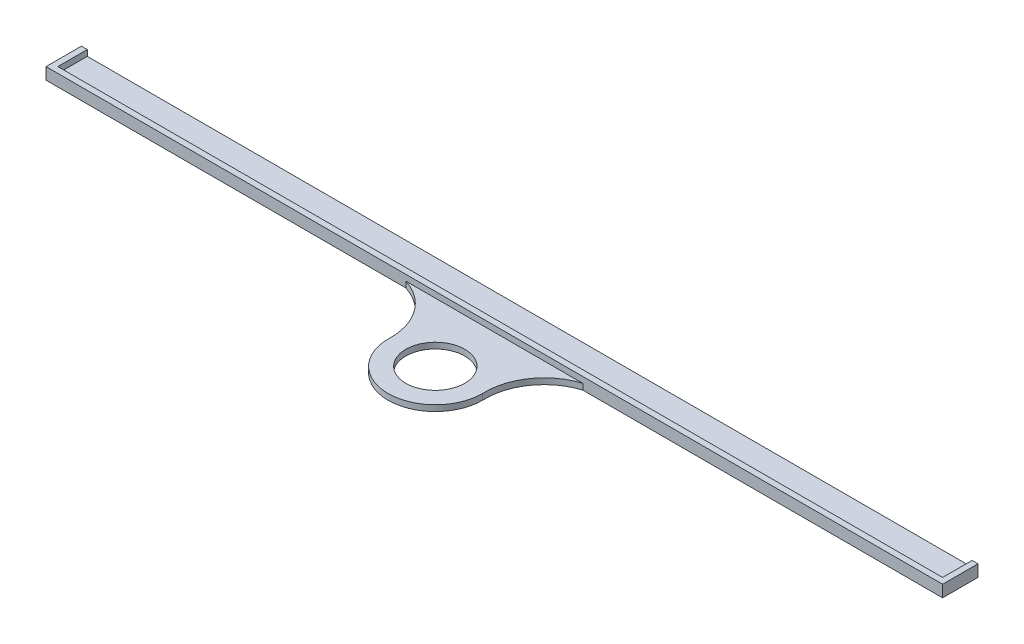
ISO-10303-21;
HEADER;
FILE_DESCRIPTION(('STEP AP214'),'2;1');
FILE_NAME('part.step','',(''),(''),'','','');
FILE_SCHEMA(('AUTOMOTIVE_DESIGN { 1 0 10303 214 1 1 1 1 }'));
ENDSEC;
DATA;
#1=APPLICATION_CONTEXT('core data for automotive mechanical design processes');
#2=APPLICATION_PROTOCOL_DEFINITION('international standard','automotive_design',2000,#1);
#3=PRODUCT_CONTEXT('',#1,'mechanical');
#4=PRODUCT('Part','Part','',(#3));
#5=PRODUCT_RELATED_PRODUCT_CATEGORY('part','',(#4));
#6=PRODUCT_DEFINITION_FORMATION('','',#4);
#7=PRODUCT_DEFINITION_CONTEXT('part definition',#1,'design');
#8=PRODUCT_DEFINITION('design','',#6,#7);
#9=PRODUCT_DEFINITION_SHAPE('','',#8);
#10=(LENGTH_UNIT() NAMED_UNIT(*) SI_UNIT(.MILLI.,.METRE.));
#11=(NAMED_UNIT(*) PLANE_ANGLE_UNIT() SI_UNIT($,.RADIAN.));
#12=(NAMED_UNIT(*) SI_UNIT($,.STERADIAN.) SOLID_ANGLE_UNIT());
#13=UNCERTAINTY_MEASURE_WITH_UNIT(LENGTH_MEASURE(1.E-05),#10,'distance_accuracy_value','');
#14=(GEOMETRIC_REPRESENTATION_CONTEXT(3) GLOBAL_UNCERTAINTY_ASSIGNED_CONTEXT((#13)) GLOBAL_UNIT_ASSIGNED_CONTEXT((#10,
#11,#12)) REPRESENTATION_CONTEXT('',''));
#15=CARTESIAN_POINT('',(0.,0.,0.));
#16=DIRECTION('',(0.,0.,1.));
#17=DIRECTION('',(1.,0.,0.));
#18=AXIS2_PLACEMENT_3D('',#15,#16,#17);
#19=CARTESIAN_POINT('',(0.,0.,0.));
#20=DIRECTION('',(0.,1.,0.));
#21=DIRECTION('',(0.,0.,1.));
#22=AXIS2_PLACEMENT_3D('',#19,#20,#21);
#23=PLANE('',#22);
#24=DIRECTION('',(1.,0.,0.));
#25=VECTOR('',#24,1.);
#26=CARTESIAN_POINT('',(0.,0.,-5.99999999999999));
#27=LINE('',#26,#25);
#28=CARTESIAN_POINT('',(-150.,0.,-5.99999999999999));
#29=VERTEX_POINT('',#28);
#30=CARTESIAN_POINT('',(150.,0.,-5.99999999999999));
#31=VERTEX_POINT('',#30);
#32=EDGE_CURVE('E217',#29,#31,#27,.T.);
#33=ORIENTED_EDGE('',*,*,#32,.F.);
#34=DIRECTION('',(0.,0.,1.));
#35=VECTOR('',#34,1.);
#36=CARTESIAN_POINT('',(-150.,0.,0.));
#37=LINE('',#36,#35);
#38=CARTESIAN_POINT('',(-150.,0.,4.00000000000001));
#39=VERTEX_POINT('',#38);
#40=EDGE_CURVE('E58',#29,#39,#37,.T.);
#41=ORIENTED_EDGE('',*,*,#40,.T.);
#42=DIRECTION('',(1.,0.,0.));
#43=VECTOR('',#42,1.);
#44=CARTESIAN_POINT('',(0.,0.,3.99999999999999));
#45=LINE('',#44,#43);
#46=CARTESIAN_POINT('',(150.,0.,3.99999999999999));
#47=VERTEX_POINT('',#46);
#48=EDGE_CURVE('E63',#39,#47,#45,.T.);
#49=ORIENTED_EDGE('',*,*,#48,.T.);
#50=DIRECTION('',(0.,0.,1.));
#51=VECTOR('',#50,1.);
#52=CARTESIAN_POINT('',(150.,0.,0.));
#53=LINE('',#52,#51);
#54=EDGE_CURVE('E173',#31,#47,#53,.T.);
#55=ORIENTED_EDGE('',*,*,#54,.F.);
#56=EDGE_LOOP('',(#33,#41,#49,#55));
#57=FACE_BOUND('',#56,.T.);
#58=ADVANCED_FACE('F41',(#57),#23,.T.);
#59=CARTESIAN_POINT('',(-152.,-2.,0.));
#60=DIRECTION('',(1.,0.,0.));
#61=DIRECTION('',(0.,0.,-1.));
#62=AXIS2_PLACEMENT_3D('',#59,#60,#61);
#63=PLANE('',#62);
#64=DIRECTION('',(0.,1.,0.));
#65=VECTOR('',#64,1.);
#66=CARTESIAN_POINT('',(-152.,-2.,6.00000000000001));
#67=LINE('',#66,#65);
#68=CARTESIAN_POINT('',(-152.,-2.,6.00000000000001));
#69=VERTEX_POINT('',#68);
#70=CARTESIAN_POINT('',(-152.,2.,6.00000000000001));
#71=VERTEX_POINT('',#70);
#72=EDGE_CURVE('E50',#69,#71,#67,.T.);
#73=ORIENTED_EDGE('',*,*,#72,.T.);
#74=DIRECTION('',(0.,0.,1.));
#75=VECTOR('',#74,1.);
#76=CARTESIAN_POINT('',(-152.,2.,0.));
#77=LINE('',#76,#75);
#78=CARTESIAN_POINT('',(-152.,2.,-5.99999999999999));
#79=VERTEX_POINT('',#78);
#80=EDGE_CURVE('E135',#79,#71,#77,.T.);
#81=ORIENTED_EDGE('',*,*,#80,.F.);
#82=DIRECTION('',(0.,1.,0.));
#83=VECTOR('',#82,1.);
#84=CARTESIAN_POINT('',(-152.,-2.,-5.99999999999999));
#85=LINE('',#84,#83);
#86=CARTESIAN_POINT('',(-152.,-2.,-5.99999999999999));
#87=VERTEX_POINT('',#86);
#88=EDGE_CURVE('E140',#87,#79,#85,.T.);
#89=ORIENTED_EDGE('',*,*,#88,.F.);
#90=DIRECTION('',(0.,0.,-1.));
#91=VECTOR('',#90,1.);
#92=CARTESIAN_POINT('',(-152.,-2.,0.));
#93=LINE('',#92,#91);
#94=EDGE_CURVE('E136',#69,#87,#93,.T.);
#95=ORIENTED_EDGE('',*,*,#94,.F.);
#96=EDGE_LOOP('',(#73,#81,#89,#95));
#97=FACE_BOUND('',#96,.T.);
#98=ADVANCED_FACE('F132',(#97),#63,.F.);
#99=CARTESIAN_POINT('',(0.,-2.,-5.99999999999999));
#100=DIRECTION('',(0.,0.,1.));
#101=DIRECTION('',(1.,0.,0.));
#102=AXIS2_PLACEMENT_3D('',#99,#100,#101);
#103=PLANE('',#102);
#104=ORIENTED_EDGE('',*,*,#88,.T.);
#105=DIRECTION('',(-1.,0.,0.));
#106=VECTOR('',#105,1.);
#107=CARTESIAN_POINT('',(0.,2.,-5.99999999999999));
#108=LINE('',#107,#106);
#109=CARTESIAN_POINT('',(-150.,2.,-5.99999999999999));
#110=VERTEX_POINT('',#109);
#111=EDGE_CURVE('E156',#110,#79,#108,.T.);
#112=ORIENTED_EDGE('',*,*,#111,.F.);
#113=DIRECTION('',(0.,-1.,0.));
#114=VECTOR('',#113,1.);
#115=CARTESIAN_POINT('',(-150.,2.,-5.99999999999999));
#116=LINE('',#115,#114);
#117=EDGE_CURVE('E171',#110,#29,#116,.T.);
#118=ORIENTED_EDGE('',*,*,#117,.T.);
#119=ORIENTED_EDGE('',*,*,#32,.T.);
#120=DIRECTION('',(0.,-1.,0.));
#121=VECTOR('',#120,1.);
#122=CARTESIAN_POINT('',(150.,2.,-5.99999999999999));
#123=LINE('',#122,#121);
#124=CARTESIAN_POINT('',(150.,2.,-5.99999999999999));
#125=VERTEX_POINT('',#124);
#126=EDGE_CURVE('E183',#125,#31,#123,.T.);
#127=ORIENTED_EDGE('',*,*,#126,.F.);
#128=DIRECTION('',(-1.,0.,0.));
#129=VECTOR('',#128,1.);
#130=CARTESIAN_POINT('',(0.,2.,-5.99999999999999));
#131=LINE('',#130,#129);
#132=CARTESIAN_POINT('',(152.,2.,-5.99999999999999));
#133=VERTEX_POINT('',#132);
#134=EDGE_CURVE('E161',#133,#125,#131,.T.);
#135=ORIENTED_EDGE('',*,*,#134,.F.);
#136=DIRECTION('',(0.,1.,0.));
#137=VECTOR('',#136,1.);
#138=CARTESIAN_POINT('',(152.,-2.,-5.99999999999999));
#139=LINE('',#138,#137);
#140=CARTESIAN_POINT('',(152.,-2.,-5.99999999999999));
#141=VERTEX_POINT('',#140);
#142=EDGE_CURVE('E223',#141,#133,#139,.T.);
#143=ORIENTED_EDGE('',*,*,#142,.F.);
#144=DIRECTION('',(1.,0.,0.));
#145=VECTOR('',#144,1.);
#146=CARTESIAN_POINT('',(0.,-2.,-5.99999999999999));
#147=LINE('',#146,#145);
#148=EDGE_CURVE('E203',#87,#141,#147,.T.);
#149=ORIENTED_EDGE('',*,*,#148,.F.);
#150=EDGE_LOOP('',(#104,#112,#118,#119,#127,#135,#143,#149));
#151=FACE_BOUND('',#150,.T.);
#152=ADVANCED_FACE('F255',(#151),#103,.F.);
#153=CARTESIAN_POINT('',(152.,-2.,0.));
#154=DIRECTION('',(1.,0.,0.));
#155=DIRECTION('',(0.,0.,-1.));
#156=AXIS2_PLACEMENT_3D('',#153,#154,#155);
#157=PLANE('',#156);
#158=ORIENTED_EDGE('',*,*,#142,.T.);
#159=DIRECTION('',(0.,0.,-1.));
#160=VECTOR('',#159,1.);
#161=CARTESIAN_POINT('',(152.,2.,0.));
#162=LINE('',#161,#160);
#163=CARTESIAN_POINT('',(152.,2.,6.00000000000001));
#164=VERTEX_POINT('',#163);
#165=EDGE_CURVE('E150',#164,#133,#162,.T.);
#166=ORIENTED_EDGE('',*,*,#165,.F.);
#167=DIRECTION('',(0.,1.,0.));
#168=VECTOR('',#167,1.);
#169=CARTESIAN_POINT('',(152.,-2.,6.00000000000001));
#170=LINE('',#169,#168);
#171=CARTESIAN_POINT('',(152.,-2.,6.00000000000001));
#172=VERTEX_POINT('',#171);
#173=EDGE_CURVE('E146',#172,#164,#170,.T.);
#174=ORIENTED_EDGE('',*,*,#173,.F.);
#175=DIRECTION('',(0.,0.,-1.));
#176=VECTOR('',#175,1.);
#177=CARTESIAN_POINT('',(152.,-2.,0.));
#178=LINE('',#177,#176);
#179=EDGE_CURVE('E200',#172,#141,#178,.T.);
#180=ORIENTED_EDGE('',*,*,#179,.T.);
#181=EDGE_LOOP('',(#158,#166,#174,#180));
#182=FACE_BOUND('',#181,.T.);
#183=ADVANCED_FACE('F251',(#182),#157,.T.);
#184=CARTESIAN_POINT('',(0.,-2.,6.00000000000001));
#185=DIRECTION('',(0.,0.,1.));
#186=DIRECTION('',(1.,0.,0.));
#187=AXIS2_PLACEMENT_3D('',#184,#185,#186);
#188=PLANE('',#187);
#189=ORIENTED_EDGE('',*,*,#173,.T.);
#190=DIRECTION('',(1.,0.,0.));
#191=VECTOR('',#190,1.);
#192=CARTESIAN_POINT('',(0.,2.,6.00000000000001));
#193=LINE('',#192,#191);
#194=EDGE_CURVE('E143',#71,#164,#193,.T.);
#195=ORIENTED_EDGE('',*,*,#194,.F.);
#196=ORIENTED_EDGE('',*,*,#72,.F.);
#197=DIRECTION('',(1.,0.,0.));
#198=VECTOR('',#197,1.);
#199=CARTESIAN_POINT('',(0.,-2.,6.00000000000001));
#200=LINE('',#199,#198);
#201=CARTESIAN_POINT('',(-30.,-2.,6.00000000000001));
#202=VERTEX_POINT('',#201);
#203=EDGE_CURVE('E187',#69,#202,#200,.T.);
#204=ORIENTED_EDGE('',*,*,#203,.T.);
#205=DIRECTION('',(0.,1.,0.));
#206=VECTOR('',#205,1.);
#207=CARTESIAN_POINT('',(-30.,-2.,6.00000000000001));
#208=LINE('',#207,#206);
#209=CARTESIAN_POINT('',(-30.,0.,6.00000000000001));
#210=VERTEX_POINT('',#209);
#211=EDGE_CURVE('E45',#202,#210,#208,.T.);
#212=ORIENTED_EDGE('',*,*,#211,.T.);
#213=DIRECTION('',(1.,0.,0.));
#214=VECTOR('',#213,1.);
#215=CARTESIAN_POINT('',(0.,0.,6.00000000000001));
#216=LINE('',#215,#214);
#217=CARTESIAN_POINT('',(30.,0.,6.00000000000001));
#218=VERTEX_POINT('',#217);
#219=EDGE_CURVE('E11',#210,#218,#216,.T.);
#220=ORIENTED_EDGE('',*,*,#219,.T.);
#221=DIRECTION('',(0.,1.,0.));
#222=VECTOR('',#221,1.);
#223=CARTESIAN_POINT('',(30.,-2.,6.00000000000001));
#224=LINE('',#223,#222);
#225=CARTESIAN_POINT('',(30.,-2.,6.00000000000001));
#226=VERTEX_POINT('',#225);
#227=EDGE_CURVE('E226',#226,#218,#224,.T.);
#228=ORIENTED_EDGE('',*,*,#227,.F.);
#229=EDGE_CURVE('E191',#226,#172,#200,.T.);
#230=ORIENTED_EDGE('',*,*,#229,.T.);
#231=EDGE_LOOP('',(#189,#195,#196,#204,#212,#220,#228,#230));
#232=FACE_BOUND('',#231,.T.);
#233=ADVANCED_FACE('F144',(#232),#188,.T.);
#234=CARTESIAN_POINT('',(35.9790745370741,-2.,25.0853521759519));
#235=DIRECTION('',(0.,1.,0.));
#236=DIRECTION('',(0.,0.,1.));
#237=AXIS2_PLACEMENT_3D('',#234,#235,#236);
#238=CYLINDRICAL_SURFACE('',#237,20.);
#239=CARTESIAN_POINT('',(35.9790745370741,0.,25.0853521759519));
#240=DIRECTION('',(0.,1.,0.));
#241=DIRECTION('',(0.,0.,1.));
#242=AXIS2_PLACEMENT_3D('',#239,#240,#241);
#243=CIRCLE('',#242,20.);
#244=CARTESIAN_POINT('',(16.,0.,26.0000000000003));
#245=VERTEX_POINT('',#244);
#246=EDGE_CURVE('E214',#245,#218,#243,.F.);
#247=ORIENTED_EDGE('',*,*,#246,.F.);
#248=DIRECTION('',(0.,1.,0.));
#249=VECTOR('',#248,1.);
#250=CARTESIAN_POINT('',(16.,-2.,26.0000000000003));
#251=LINE('',#250,#249);
#252=CARTESIAN_POINT('',(16.,-2.,26.0000000000003));
#253=VERTEX_POINT('',#252);
#254=EDGE_CURVE('E228',#253,#245,#251,.T.);
#255=ORIENTED_EDGE('',*,*,#254,.F.);
#256=CARTESIAN_POINT('',(35.9790745370741,-2.,25.0853521759519));
#257=DIRECTION('',(0.,1.,0.));
#258=DIRECTION('',(0.,0.,1.));
#259=AXIS2_PLACEMENT_3D('',#256,#257,#258);
#260=CIRCLE('',#259,20.);
#261=EDGE_CURVE('E197',#253,#226,#260,.F.);
#262=ORIENTED_EDGE('',*,*,#261,.T.);
#263=ORIENTED_EDGE('',*,*,#227,.T.);
#264=EDGE_LOOP('',(#247,#255,#262,#263));
#265=FACE_BOUND('',#264,.T.);
#266=ADVANCED_FACE('F240',(#265),#238,.F.);
#267=CARTESIAN_POINT('',(0.,-2.,26.));
#268=DIRECTION('',(0.,1.,0.));
#269=DIRECTION('',(0.,0.,1.));
#270=AXIS2_PLACEMENT_3D('',#267,#268,#269);
#271=CYLINDRICAL_SURFACE('',#270,16.);
#272=CARTESIAN_POINT('',(0.,0.,26.));
#273=DIRECTION('',(0.,1.,0.));
#274=DIRECTION('',(0.,0.,1.));
#275=AXIS2_PLACEMENT_3D('',#272,#273,#274);
#276=CIRCLE('',#275,16.);
#277=CARTESIAN_POINT('',(-16.,0.,25.9999999999997));
#278=VERTEX_POINT('',#277);
#279=EDGE_CURVE('E211',#278,#245,#276,.T.);
#280=ORIENTED_EDGE('',*,*,#279,.F.);
#281=DIRECTION('',(0.,1.,0.));
#282=VECTOR('',#281,1.);
#283=CARTESIAN_POINT('',(-16.,-2.,25.9999999999997));
#284=LINE('',#283,#282);
#285=CARTESIAN_POINT('',(-16.,-2.,25.9999999999997));
#286=VERTEX_POINT('',#285);
#287=EDGE_CURVE('E229',#286,#278,#284,.T.);
#288=ORIENTED_EDGE('',*,*,#287,.F.);
#289=CARTESIAN_POINT('',(0.,-2.,26.));
#290=DIRECTION('',(0.,1.,0.));
#291=DIRECTION('',(0.,0.,1.));
#292=AXIS2_PLACEMENT_3D('',#289,#290,#291);
#293=CIRCLE('',#292,16.);
#294=EDGE_CURVE('E194',#286,#253,#293,.T.);
#295=ORIENTED_EDGE('',*,*,#294,.T.);
#296=ORIENTED_EDGE('',*,*,#254,.T.);
#297=EDGE_LOOP('',(#280,#288,#295,#296));
#298=FACE_BOUND('',#297,.T.);
#299=ADVANCED_FACE('F331',(#298),#271,.T.);
#300=CARTESIAN_POINT('',(-35.9790745370742,-2.,25.0853521759519));
#301=DIRECTION('',(0.,1.,0.));
#302=DIRECTION('',(0.,0.,1.));
#303=AXIS2_PLACEMENT_3D('',#300,#301,#302);
#304=CYLINDRICAL_SURFACE('',#303,20.);
#305=CARTESIAN_POINT('',(-35.9790745370742,0.,25.0853521759519));
#306=DIRECTION('',(0.,1.,0.));
#307=DIRECTION('',(0.,0.,1.));
#308=AXIS2_PLACEMENT_3D('',#305,#306,#307);
#309=CIRCLE('',#308,20.);
#310=EDGE_CURVE('E186',#210,#278,#309,.F.);
#311=ORIENTED_EDGE('',*,*,#310,.F.);
#312=ORIENTED_EDGE('',*,*,#211,.F.);
#313=CARTESIAN_POINT('',(-35.9790745370742,-2.,25.0853521759519));
#314=DIRECTION('',(0.,1.,0.));
#315=DIRECTION('',(0.,0.,1.));
#316=AXIS2_PLACEMENT_3D('',#313,#314,#315);
#317=CIRCLE('',#316,20.);
#318=EDGE_CURVE('E189',#202,#286,#317,.F.);
#319=ORIENTED_EDGE('',*,*,#318,.T.);
#320=ORIENTED_EDGE('',*,*,#287,.T.);
#321=EDGE_LOOP('',(#311,#312,#319,#320));
#322=FACE_BOUND('',#321,.T.);
#323=ADVANCED_FACE('F43',(#322),#304,.F.);
#324=CARTESIAN_POINT('',(0.,-2.,26.));
#325=DIRECTION('',(0.,1.,0.));
#326=DIRECTION('',(0.,0.,1.));
#327=AXIS2_PLACEMENT_3D('',#324,#325,#326);
#328=CYLINDRICAL_SURFACE('',#327,10.);
#329=CARTESIAN_POINT('',(0.,-2.,26.));
#330=DIRECTION('',(0.,1.,0.));
#331=DIRECTION('',(0.,0.,1.));
#332=AXIS2_PLACEMENT_3D('',#329,#330,#331);
#333=CIRCLE('',#332,10.);
#334=CARTESIAN_POINT('',(0.,-2.,36.));
#335=VERTEX_POINT('',#334);
#336=EDGE_CURVE('E206',#335,#335,#333,.T.);
#337=ORIENTED_EDGE('',*,*,#336,.F.);
#338=EDGE_LOOP('',(#337));
#339=FACE_BOUND('',#338,.T.);
#340=CARTESIAN_POINT('',(0.,0.,26.));
#341=DIRECTION('',(0.,1.,0.));
#342=DIRECTION('',(0.,0.,1.));
#343=AXIS2_PLACEMENT_3D('',#340,#341,#342);
#344=CIRCLE('',#343,10.);
#345=CARTESIAN_POINT('',(0.,0.,36.));
#346=VERTEX_POINT('',#345);
#347=EDGE_CURVE('E190',#346,#346,#344,.T.);
#348=ORIENTED_EDGE('',*,*,#347,.T.);
#349=EDGE_LOOP('',(#348));
#350=FACE_BOUND('',#349,.T.);
#351=ADVANCED_FACE('F280',(#339,#350),#328,.F.);
#352=CARTESIAN_POINT('',(0.,-2.,0.));
#353=DIRECTION('',(0.,1.,0.));
#354=DIRECTION('',(0.,0.,1.));
#355=AXIS2_PLACEMENT_3D('',#352,#353,#354);
#356=PLANE('',#355);
#357=ORIENTED_EDGE('',*,*,#203,.F.);
#358=ORIENTED_EDGE('',*,*,#94,.T.);
#359=ORIENTED_EDGE('',*,*,#148,.T.);
#360=ORIENTED_EDGE('',*,*,#179,.F.);
#361=ORIENTED_EDGE('',*,*,#229,.F.);
#362=ORIENTED_EDGE('',*,*,#261,.F.);
#363=ORIENTED_EDGE('',*,*,#294,.F.);
#364=ORIENTED_EDGE('',*,*,#318,.F.);
#365=EDGE_LOOP('',(#357,#358,#359,#360,#361,#362,#363,#364));
#366=FACE_BOUND('',#365,.T.);
#367=ORIENTED_EDGE('',*,*,#336,.T.);
#368=EDGE_LOOP('',(#367));
#369=FACE_BOUND('',#368,.T.);
#370=ADVANCED_FACE('F245',(#366,#369),#356,.F.);
#371=ORIENTED_EDGE('',*,*,#219,.F.);
#372=ORIENTED_EDGE('',*,*,#310,.T.);
#373=ORIENTED_EDGE('',*,*,#279,.T.);
#374=ORIENTED_EDGE('',*,*,#246,.T.);
#375=EDGE_LOOP('',(#371,#372,#373,#374));
#376=FACE_BOUND('',#375,.T.);
#377=ORIENTED_EDGE('',*,*,#347,.F.);
#378=EDGE_LOOP('',(#377));
#379=FACE_BOUND('',#378,.T.);
#380=ADVANCED_FACE('F236',(#376,#379),#23,.T.);
#381=CARTESIAN_POINT('',(150.,2.,0.));
#382=DIRECTION('',(1.,0.,0.));
#383=DIRECTION('',(0.,0.,-1.));
#384=AXIS2_PLACEMENT_3D('',#381,#382,#383);
#385=PLANE('',#384);
#386=ORIENTED_EDGE('',*,*,#54,.T.);
#387=DIRECTION('',(0.,-1.,0.));
#388=VECTOR('',#387,1.);
#389=CARTESIAN_POINT('',(150.,2.,3.99999999999999));
#390=LINE('',#389,#388);
#391=CARTESIAN_POINT('',(150.,2.,3.99999999999999));
#392=VERTEX_POINT('',#391);
#393=EDGE_CURVE('E181',#392,#47,#390,.T.);
#394=ORIENTED_EDGE('',*,*,#393,.F.);
#395=DIRECTION('',(0.,0.,1.));
#396=VECTOR('',#395,1.);
#397=CARTESIAN_POINT('',(150.,2.,0.));
#398=LINE('',#397,#396);
#399=EDGE_CURVE('E163',#125,#392,#398,.T.);
#400=ORIENTED_EDGE('',*,*,#399,.F.);
#401=ORIENTED_EDGE('',*,*,#126,.T.);
#402=EDGE_LOOP('',(#386,#394,#400,#401));
#403=FACE_BOUND('',#402,.T.);
#404=ADVANCED_FACE('F259',(#403),#385,.F.);
#405=CARTESIAN_POINT('',(0.,2.,3.99999999999999));
#406=DIRECTION('',(0.,0.,-1.));
#407=DIRECTION('',(-1.,0.,0.));
#408=AXIS2_PLACEMENT_3D('',#405,#406,#407);
#409=PLANE('',#408);
#410=ORIENTED_EDGE('',*,*,#48,.F.);
#411=DIRECTION('',(0.,-1.,0.));
#412=VECTOR('',#411,1.);
#413=CARTESIAN_POINT('',(-150.,2.,4.00000000000001));
#414=LINE('',#413,#412);
#415=CARTESIAN_POINT('',(-150.,2.,4.00000000000001));
#416=VERTEX_POINT('',#415);
#417=EDGE_CURVE('E179',#416,#39,#414,.T.);
#418=ORIENTED_EDGE('',*,*,#417,.F.);
#419=DIRECTION('',(1.,0.,0.));
#420=VECTOR('',#419,1.);
#421=CARTESIAN_POINT('',(0.,2.,3.99999999999999));
#422=LINE('',#421,#420);
#423=EDGE_CURVE('E165',#416,#392,#422,.T.);
#424=ORIENTED_EDGE('',*,*,#423,.T.);
#425=ORIENTED_EDGE('',*,*,#393,.T.);
#426=EDGE_LOOP('',(#410,#418,#424,#425));
#427=FACE_BOUND('',#426,.T.);
#428=ADVANCED_FACE('F264',(#427),#409,.T.);
#429=CARTESIAN_POINT('',(-150.,2.,0.));
#430=DIRECTION('',(1.,0.,0.));
#431=DIRECTION('',(0.,0.,-1.));
#432=AXIS2_PLACEMENT_3D('',#429,#430,#431);
#433=PLANE('',#432);
#434=ORIENTED_EDGE('',*,*,#40,.F.);
#435=ORIENTED_EDGE('',*,*,#117,.F.);
#436=DIRECTION('',(0.,0.,1.));
#437=VECTOR('',#436,1.);
#438=CARTESIAN_POINT('',(-150.,2.,0.));
#439=LINE('',#438,#437);
#440=EDGE_CURVE('E168',#110,#416,#439,.T.);
#441=ORIENTED_EDGE('',*,*,#440,.T.);
#442=ORIENTED_EDGE('',*,*,#417,.T.);
#443=EDGE_LOOP('',(#434,#435,#441,#442));
#444=FACE_BOUND('',#443,.T.);
#445=ADVANCED_FACE('F263',(#444),#433,.T.);
#446=CARTESIAN_POINT('',(0.,2.,0.));
#447=DIRECTION('',(0.,1.,0.));
#448=DIRECTION('',(0.,0.,1.));
#449=AXIS2_PLACEMENT_3D('',#446,#447,#448);
#450=PLANE('',#449);
#451=ORIENTED_EDGE('',*,*,#80,.T.);
#452=ORIENTED_EDGE('',*,*,#194,.T.);
#453=ORIENTED_EDGE('',*,*,#165,.T.);
#454=ORIENTED_EDGE('',*,*,#134,.T.);
#455=ORIENTED_EDGE('',*,*,#399,.T.);
#456=ORIENTED_EDGE('',*,*,#423,.F.);
#457=ORIENTED_EDGE('',*,*,#440,.F.);
#458=ORIENTED_EDGE('',*,*,#111,.T.);
#459=EDGE_LOOP('',(#451,#452,#453,#454,#455,#456,#457,#458));
#460=FACE_BOUND('',#459,.T.);
#461=ADVANCED_FACE('F153',(#460),#450,.T.);
#462=CLOSED_SHELL('',(#58,#98,#152,#183,#233,#266,#299,#323,#351,#370,#380,#404,#428,#445,#461));
#463=MANIFOLD_SOLID_BREP('B2',#462);
#464=ADVANCED_BREP_SHAPE_REPRESENTATION('',(#18,#463),#14);
#465=SHAPE_DEFINITION_REPRESENTATION(#9,#464);
ENDSEC;
END-ISO-10303-21;
